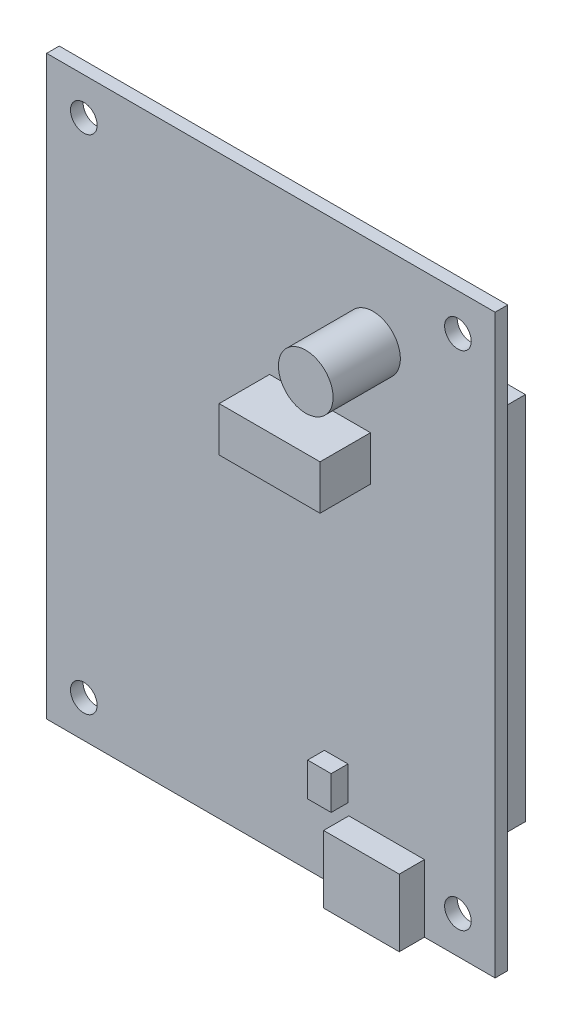
ISO-10303-21;
HEADER;
FILE_DESCRIPTION(('STEP AP214'),'2;1');
FILE_NAME('part.step','',(''),(''),'','','');
FILE_SCHEMA(('AUTOMOTIVE_DESIGN { 1 0 10303 214 1 1 1 1 }'));
ENDSEC;
DATA;
#1=APPLICATION_CONTEXT('core data for automotive mechanical design processes');
#2=APPLICATION_PROTOCOL_DEFINITION('international standard','automotive_design',2000,#1);
#3=PRODUCT_CONTEXT('',#1,'mechanical');
#4=PRODUCT('Part','Part','',(#3));
#5=PRODUCT_RELATED_PRODUCT_CATEGORY('part','',(#4));
#6=PRODUCT_DEFINITION_FORMATION('','',#4);
#7=PRODUCT_DEFINITION_CONTEXT('part definition',#1,'design');
#8=PRODUCT_DEFINITION('design','',#6,#7);
#9=PRODUCT_DEFINITION_SHAPE('','',#8);
#10=(LENGTH_UNIT() NAMED_UNIT(*) SI_UNIT(.MILLI.,.METRE.));
#11=(NAMED_UNIT(*) PLANE_ANGLE_UNIT() SI_UNIT($,.RADIAN.));
#12=(NAMED_UNIT(*) SI_UNIT($,.STERADIAN.) SOLID_ANGLE_UNIT());
#13=UNCERTAINTY_MEASURE_WITH_UNIT(LENGTH_MEASURE(1.E-05),#10,'distance_accuracy_value','');
#14=(GEOMETRIC_REPRESENTATION_CONTEXT(3) GLOBAL_UNCERTAINTY_ASSIGNED_CONTEXT((#13)) GLOBAL_UNIT_ASSIGNED_CONTEXT((#10,
#11,#12)) REPRESENTATION_CONTEXT('',''));
#15=CARTESIAN_POINT('',(0.,0.,0.));
#16=DIRECTION('',(0.,0.,1.));
#17=DIRECTION('',(1.,0.,0.));
#18=AXIS2_PLACEMENT_3D('',#15,#16,#17);
#19=CARTESIAN_POINT('',(0.,0.,1.5));
#20=DIRECTION('',(0.,0.,-1.));
#21=DIRECTION('',(-1.,0.,0.));
#22=AXIS2_PLACEMENT_3D('',#19,#20,#21);
#23=PLANE('',#22);
#24=DIRECTION('',(0.,-1.,0.));
#25=VECTOR('',#24,1.);
#26=CARTESIAN_POINT('',(33.04,13.3,1.5));
#27=LINE('',#26,#25);
#28=CARTESIAN_POINT('',(33.04,13.3,1.5));
#29=VERTEX_POINT('',#28);
#30=CARTESIAN_POINT('',(33.04,9.3,1.5));
#31=VERTEX_POINT('',#30);
#32=EDGE_CURVE('E312',#29,#31,#27,.T.);
#33=ORIENTED_EDGE('',*,*,#32,.F.);
#34=DIRECTION('',(-1.,0.,0.));
#35=VECTOR('',#34,1.);
#36=CARTESIAN_POINT('',(33.04,13.3,1.5));
#37=LINE('',#36,#35);
#38=CARTESIAN_POINT('',(35.84,13.3,1.5));
#39=VERTEX_POINT('',#38);
#40=EDGE_CURVE('E318',#39,#29,#37,.T.);
#41=ORIENTED_EDGE('',*,*,#40,.F.);
#42=DIRECTION('',(0.,1.,0.));
#43=VECTOR('',#42,1.);
#44=CARTESIAN_POINT('',(35.84,13.3,1.5));
#45=LINE('',#44,#43);
#46=CARTESIAN_POINT('',(35.84,9.3,1.5));
#47=VERTEX_POINT('',#46);
#48=EDGE_CURVE('E335',#47,#39,#45,.T.);
#49=ORIENTED_EDGE('',*,*,#48,.F.);
#50=DIRECTION('',(1.,0.,0.));
#51=VECTOR('',#50,1.);
#52=CARTESIAN_POINT('',(33.04,9.3,1.5));
#53=LINE('',#52,#51);
#54=EDGE_CURVE('E331',#31,#47,#53,.T.);
#55=ORIENTED_EDGE('',*,*,#54,.F.);
#56=EDGE_LOOP('',(#33,#41,#49,#55));
#57=FACE_BOUND('',#56,.T.);
#58=CARTESIAN_POINT('',(48.92,4.42,1.5));
#59=DIRECTION('',(0.,0.,1.));
#60=DIRECTION('',(1.,0.,0.));
#61=AXIS2_PLACEMENT_3D('',#58,#59,#60);
#62=CIRCLE('',#61,1.585);
#63=CARTESIAN_POINT('',(50.505,4.42,1.5));
#64=VERTEX_POINT('',#63);
#65=EDGE_CURVE('E407',#64,#64,#62,.T.);
#66=ORIENTED_EDGE('',*,*,#65,.F.);
#67=EDGE_LOOP('',(#66));
#68=FACE_BOUND('',#67,.T.);
#69=CARTESIAN_POINT('',(4.42000000000001,4.42,1.5));
#70=DIRECTION('',(0.,0.,1.));
#71=DIRECTION('',(1.,0.,0.));
#72=AXIS2_PLACEMENT_3D('',#69,#70,#71);
#73=CIRCLE('',#72,1.585);
#74=CARTESIAN_POINT('',(6.00500000000001,4.42,1.5));
#75=VERTEX_POINT('',#74);
#76=EDGE_CURVE('E415',#75,#75,#73,.T.);
#77=ORIENTED_EDGE('',*,*,#76,.F.);
#78=EDGE_LOOP('',(#77));
#79=FACE_BOUND('',#78,.T.);
#80=CARTESIAN_POINT('',(4.42,64.16,1.5));
#81=DIRECTION('',(0.,0.,1.));
#82=DIRECTION('',(1.,0.,0.));
#83=AXIS2_PLACEMENT_3D('',#80,#81,#82);
#84=CIRCLE('',#83,1.58499999999999);
#85=CARTESIAN_POINT('',(6.00499999999999,64.16,1.5));
#86=VERTEX_POINT('',#85);
#87=EDGE_CURVE('E423',#86,#86,#84,.T.);
#88=ORIENTED_EDGE('',*,*,#87,.F.);
#89=EDGE_LOOP('',(#88));
#90=FACE_BOUND('',#89,.T.);
#91=CARTESIAN_POINT('',(48.92,64.16,1.5));
#92=DIRECTION('',(0.,0.,1.));
#93=DIRECTION('',(1.,0.,0.));
#94=AXIS2_PLACEMENT_3D('',#91,#92,#93);
#95=CIRCLE('',#94,1.585);
#96=CARTESIAN_POINT('',(50.505,64.16,1.5));
#97=VERTEX_POINT('',#96);
#98=EDGE_CURVE('E431',#97,#97,#95,.T.);
#99=ORIENTED_EDGE('',*,*,#98,.F.);
#100=EDGE_LOOP('',(#99));
#101=FACE_BOUND('',#100,.T.);
#102=CARTESIAN_POINT('',(38.82,58.16,1.5));
#103=DIRECTION('',(0.,0.,-1.));
#104=DIRECTION('',(-1.,0.,0.));
#105=AXIS2_PLACEMENT_3D('',#102,#103,#104);
#106=CIRCLE('',#105,3.25);
#107=CARTESIAN_POINT('',(35.57,58.16,1.5));
#108=VERTEX_POINT('',#107);
#109=EDGE_CURVE('E11',#108,#108,#106,.F.);
#110=ORIENTED_EDGE('',*,*,#109,.F.);
#111=EDGE_LOOP('',(#110));
#112=FACE_BOUND('',#111,.T.);
#113=DIRECTION('',(0.,1.,0.));
#114=VECTOR('',#113,1.);
#115=CARTESIAN_POINT('',(38.52,48.76,1.5));
#116=LINE('',#115,#114);
#117=CARTESIAN_POINT('',(38.52,43.46,1.5));
#118=VERTEX_POINT('',#117);
#119=CARTESIAN_POINT('',(38.52,48.76,1.5));
#120=VERTEX_POINT('',#119);
#121=EDGE_CURVE('E357',#118,#120,#116,.T.);
#122=ORIENTED_EDGE('',*,*,#121,.F.);
#123=DIRECTION('',(1.,0.,0.));
#124=VECTOR('',#123,1.);
#125=CARTESIAN_POINT('',(38.52,43.46,1.5));
#126=LINE('',#125,#124);
#127=CARTESIAN_POINT('',(26.52,43.46,1.5));
#128=VERTEX_POINT('',#127);
#129=EDGE_CURVE('E363',#128,#118,#126,.T.);
#130=ORIENTED_EDGE('',*,*,#129,.F.);
#131=DIRECTION('',(0.,-1.,0.));
#132=VECTOR('',#131,1.);
#133=CARTESIAN_POINT('',(26.52,48.76,1.5));
#134=LINE('',#133,#132);
#135=CARTESIAN_POINT('',(26.52,48.76,1.5));
#136=VERTEX_POINT('',#135);
#137=EDGE_CURVE('E380',#136,#128,#134,.T.);
#138=ORIENTED_EDGE('',*,*,#137,.F.);
#139=DIRECTION('',(-1.,0.,0.));
#140=VECTOR('',#139,1.);
#141=CARTESIAN_POINT('',(38.52,48.76,1.5));
#142=LINE('',#141,#140);
#143=EDGE_CURVE('E376',#120,#136,#142,.T.);
#144=ORIENTED_EDGE('',*,*,#143,.F.);
#145=EDGE_LOOP('',(#122,#130,#138,#144));
#146=FACE_BOUND('',#145,.T.);
#147=DIRECTION('',(0.,-1.,0.));
#148=VECTOR('',#147,1.);
#149=CARTESIAN_POINT('',(35.94,0.,1.5));
#150=LINE('',#149,#148);
#151=CARTESIAN_POINT('',(35.94,8.,1.5));
#152=VERTEX_POINT('',#151);
#153=CARTESIAN_POINT('',(35.94,0.,1.5));
#154=VERTEX_POINT('',#153);
#155=EDGE_CURVE('E55',#152,#154,#150,.T.);
#156=ORIENTED_EDGE('',*,*,#155,.F.);
#157=DIRECTION('',(-1.,0.,0.));
#158=VECTOR('',#157,1.);
#159=CARTESIAN_POINT('',(35.94,8.,1.5));
#160=LINE('',#159,#158);
#161=CARTESIAN_POINT('',(44.94,8.,1.5));
#162=VERTEX_POINT('',#161);
#163=EDGE_CURVE('E59',#162,#152,#160,.T.);
#164=ORIENTED_EDGE('',*,*,#163,.F.);
#165=DIRECTION('',(0.,1.,0.));
#166=VECTOR('',#165,1.);
#167=CARTESIAN_POINT('',(44.94,0.,1.5));
#168=LINE('',#167,#166);
#169=CARTESIAN_POINT('',(44.94,0.,1.5));
#170=VERTEX_POINT('',#169);
#171=EDGE_CURVE('E496',#170,#162,#168,.T.);
#172=ORIENTED_EDGE('',*,*,#171,.F.);
#173=DIRECTION('',(1.,0.,0.));
#174=VECTOR('',#173,1.);
#175=CARTESIAN_POINT('',(0.,0.,1.5));
#176=LINE('',#175,#174);
#177=CARTESIAN_POINT('',(53.34,0.,1.5));
#178=VERTEX_POINT('',#177);
#179=EDGE_CURVE('E443',#170,#178,#176,.T.);
#180=ORIENTED_EDGE('',*,*,#179,.T.);
#181=DIRECTION('',(0.,1.,0.));
#182=VECTOR('',#181,1.);
#183=CARTESIAN_POINT('',(53.34,0.,1.5));
#184=LINE('',#183,#182);
#185=CARTESIAN_POINT('',(53.34,68.58,1.5));
#186=VERTEX_POINT('',#185);
#187=EDGE_CURVE('E448',#178,#186,#184,.T.);
#188=ORIENTED_EDGE('',*,*,#187,.T.);
#189=DIRECTION('',(-1.,0.,0.));
#190=VECTOR('',#189,1.);
#191=CARTESIAN_POINT('',(0.,68.58,1.5));
#192=LINE('',#191,#190);
#193=CARTESIAN_POINT('',(0.,68.58,1.5));
#194=VERTEX_POINT('',#193);
#195=EDGE_CURVE('E451',#186,#194,#192,.T.);
#196=ORIENTED_EDGE('',*,*,#195,.T.);
#197=DIRECTION('',(0.,-1.,0.));
#198=VECTOR('',#197,1.);
#199=CARTESIAN_POINT('',(0.,0.,1.5));
#200=LINE('',#199,#198);
#201=CARTESIAN_POINT('',(0.,0.,1.5));
#202=VERTEX_POINT('',#201);
#203=EDGE_CURVE('E439',#194,#202,#200,.T.);
#204=ORIENTED_EDGE('',*,*,#203,.T.);
#205=EDGE_CURVE('E445',#202,#154,#176,.T.);
#206=ORIENTED_EDGE('',*,*,#205,.T.);
#207=EDGE_LOOP('',(#156,#164,#172,#180,#188,#196,#204,#206));
#208=FACE_BOUND('',#207,.T.);
#209=ADVANCED_FACE('F39',(#57,#68,#79,#90,#101,#112,#146,#208),#23,.F.);
#210=CARTESIAN_POINT('',(0.,0.,0.));
#211=DIRECTION('',(0.,0.,-1.));
#212=DIRECTION('',(-1.,0.,0.));
#213=AXIS2_PLACEMENT_3D('',#210,#211,#212);
#214=PLANE('',#213);
#215=CARTESIAN_POINT('',(4.42000000000001,4.42,0.));
#216=DIRECTION('',(0.,0.,1.));
#217=DIRECTION('',(1.,0.,0.));
#218=AXIS2_PLACEMENT_3D('',#215,#216,#217);
#219=CIRCLE('',#218,1.585);
#220=CARTESIAN_POINT('',(6.00500000000001,4.42,0.));
#221=VERTEX_POINT('',#220);
#222=EDGE_CURVE('E411',#221,#221,#219,.T.);
#223=ORIENTED_EDGE('',*,*,#222,.T.);
#224=EDGE_LOOP('',(#223));
#225=FACE_BOUND('',#224,.T.);
#226=CARTESIAN_POINT('',(48.92,64.16,0.));
#227=DIRECTION('',(0.,0.,1.));
#228=DIRECTION('',(1.,0.,0.));
#229=AXIS2_PLACEMENT_3D('',#226,#227,#228);
#230=CIRCLE('',#229,1.585);
#231=CARTESIAN_POINT('',(50.505,64.16,0.));
#232=VERTEX_POINT('',#231);
#233=EDGE_CURVE('E427',#232,#232,#230,.T.);
#234=ORIENTED_EDGE('',*,*,#233,.T.);
#235=EDGE_LOOP('',(#234));
#236=FACE_BOUND('',#235,.T.);
#237=DIRECTION('',(0.,-1.,0.));
#238=VECTOR('',#237,1.);
#239=CARTESIAN_POINT('',(0.,0.,0.));
#240=LINE('',#239,#238);
#241=CARTESIAN_POINT('',(0.,68.58,0.));
#242=VERTEX_POINT('',#241);
#243=CARTESIAN_POINT('',(0.,0.,0.));
#244=VERTEX_POINT('',#243);
#245=EDGE_CURVE('E435',#242,#244,#240,.T.);
#246=ORIENTED_EDGE('',*,*,#245,.F.);
#247=DIRECTION('',(-1.,0.,0.));
#248=VECTOR('',#247,1.);
#249=CARTESIAN_POINT('',(0.,68.58,0.));
#250=LINE('',#249,#248);
#251=CARTESIAN_POINT('',(53.34,68.58,0.));
#252=VERTEX_POINT('',#251);
#253=EDGE_CURVE('E444',#252,#242,#250,.T.);
#254=ORIENTED_EDGE('',*,*,#253,.F.);
#255=DIRECTION('',(0.,1.,0.));
#256=VECTOR('',#255,1.);
#257=CARTESIAN_POINT('',(53.34,0.,0.));
#258=LINE('',#257,#256);
#259=CARTESIAN_POINT('',(53.34,0.,0.));
#260=VERTEX_POINT('',#259);
#261=EDGE_CURVE('E461',#260,#252,#258,.T.);
#262=ORIENTED_EDGE('',*,*,#261,.F.);
#263=DIRECTION('',(1.,0.,0.));
#264=VECTOR('',#263,1.);
#265=CARTESIAN_POINT('',(0.,0.,0.));
#266=LINE('',#265,#264);
#267=EDGE_CURVE('E458',#244,#260,#266,.T.);
#268=ORIENTED_EDGE('',*,*,#267,.F.);
#269=EDGE_LOOP('',(#246,#254,#262,#268));
#270=FACE_BOUND('',#269,.T.);
#271=CARTESIAN_POINT('',(4.42,64.16,0.));
#272=DIRECTION('',(0.,0.,1.));
#273=DIRECTION('',(1.,0.,0.));
#274=AXIS2_PLACEMENT_3D('',#271,#272,#273);
#275=CIRCLE('',#274,1.58499999999999);
#276=CARTESIAN_POINT('',(6.00499999999999,64.16,0.));
#277=VERTEX_POINT('',#276);
#278=EDGE_CURVE('E419',#277,#277,#275,.T.);
#279=ORIENTED_EDGE('',*,*,#278,.T.);
#280=EDGE_LOOP('',(#279));
#281=FACE_BOUND('',#280,.T.);
#282=CARTESIAN_POINT('',(48.92,4.42,0.));
#283=DIRECTION('',(0.,0.,1.));
#284=DIRECTION('',(1.,0.,0.));
#285=AXIS2_PLACEMENT_3D('',#282,#283,#284);
#286=CIRCLE('',#285,1.585);
#287=CARTESIAN_POINT('',(50.505,4.42,0.));
#288=VERTEX_POINT('',#287);
#289=EDGE_CURVE('E406',#288,#288,#286,.T.);
#290=ORIENTED_EDGE('',*,*,#289,.T.);
#291=EDGE_LOOP('',(#290));
#292=FACE_BOUND('',#291,.T.);
#293=DIRECTION('',(1.,0.,0.));
#294=VECTOR('',#293,1.);
#295=CARTESIAN_POINT('',(46.64,56.4,0.));
#296=LINE('',#295,#294);
#297=CARTESIAN_POINT('',(46.64,56.4,0.));
#298=VERTEX_POINT('',#297);
#299=CARTESIAN_POINT('',(51.44,56.4,0.));
#300=VERTEX_POINT('',#299);
#301=EDGE_CURVE('E290',#298,#300,#296,.T.);
#302=ORIENTED_EDGE('',*,*,#301,.F.);
#303=DIRECTION('',(0.,1.,0.));
#304=VECTOR('',#303,1.);
#305=CARTESIAN_POINT('',(46.64,56.4,0.));
#306=LINE('',#305,#304);
#307=CARTESIAN_POINT('',(46.64,12.4,0.));
#308=VERTEX_POINT('',#307);
#309=EDGE_CURVE('E271',#308,#298,#306,.T.);
#310=ORIENTED_EDGE('',*,*,#309,.F.);
#311=DIRECTION('',(-1.,0.,0.));
#312=VECTOR('',#311,1.);
#313=CARTESIAN_POINT('',(46.64,12.4,0.));
#314=LINE('',#313,#312);
#315=CARTESIAN_POINT('',(51.44,12.4,0.));
#316=VERTEX_POINT('',#315);
#317=EDGE_CURVE('E277',#316,#308,#314,.T.);
#318=ORIENTED_EDGE('',*,*,#317,.F.);
#319=DIRECTION('',(0.,-1.,0.));
#320=VECTOR('',#319,1.);
#321=CARTESIAN_POINT('',(51.44,56.4,0.));
#322=LINE('',#321,#320);
#323=EDGE_CURVE('E293',#300,#316,#322,.T.);
#324=ORIENTED_EDGE('',*,*,#323,.F.);
#325=EDGE_LOOP('',(#302,#310,#318,#324));
#326=FACE_BOUND('',#325,.T.);
#327=DIRECTION('',(1.,0.,0.));
#328=VECTOR('',#327,1.);
#329=CARTESIAN_POINT('',(1.9,56.4,0.));
#330=LINE('',#329,#328);
#331=CARTESIAN_POINT('',(1.9,56.4,0.));
#332=VERTEX_POINT('',#331);
#333=CARTESIAN_POINT('',(6.7,56.4,0.));
#334=VERTEX_POINT('',#333);
#335=EDGE_CURVE('E229',#332,#334,#330,.T.);
#336=ORIENTED_EDGE('',*,*,#335,.F.);
#337=DIRECTION('',(0.,1.,0.));
#338=VECTOR('',#337,1.);
#339=CARTESIAN_POINT('',(1.9,56.4,0.));
#340=LINE('',#339,#338);
#341=CARTESIAN_POINT('',(1.90000000000002,12.4,0.));
#342=VERTEX_POINT('',#341);
#343=EDGE_CURVE('E224',#342,#332,#340,.T.);
#344=ORIENTED_EDGE('',*,*,#343,.F.);
#345=DIRECTION('',(-1.,0.,0.));
#346=VECTOR('',#345,1.);
#347=CARTESIAN_POINT('',(1.90000000000002,12.4,0.));
#348=LINE('',#347,#346);
#349=CARTESIAN_POINT('',(6.70000000000001,12.4,0.));
#350=VERTEX_POINT('',#349);
#351=EDGE_CURVE('E240',#350,#342,#348,.T.);
#352=ORIENTED_EDGE('',*,*,#351,.F.);
#353=DIRECTION('',(0.,-1.,0.));
#354=VECTOR('',#353,1.);
#355=CARTESIAN_POINT('',(6.7,56.4,0.));
#356=LINE('',#355,#354);
#357=EDGE_CURVE('E252',#334,#350,#356,.T.);
#358=ORIENTED_EDGE('',*,*,#357,.F.);
#359=EDGE_LOOP('',(#336,#344,#352,#358));
#360=FACE_BOUND('',#359,.T.);
#361=ADVANCED_FACE('F486',(#225,#236,#270,#281,#292,#326,#360),#214,.T.);
#362=CARTESIAN_POINT('',(0.,0.,1.5));
#363=DIRECTION('',(1.,0.,0.));
#364=DIRECTION('',(0.,0.,-1.));
#365=AXIS2_PLACEMENT_3D('',#362,#363,#364);
#366=PLANE('',#365);
#367=ORIENTED_EDGE('',*,*,#245,.T.);
#368=DIRECTION('',(0.,0.,-1.));
#369=VECTOR('',#368,1.);
#370=CARTESIAN_POINT('',(0.,0.,1.5));
#371=LINE('',#370,#369);
#372=EDGE_CURVE('E48',#202,#244,#371,.T.);
#373=ORIENTED_EDGE('',*,*,#372,.F.);
#374=ORIENTED_EDGE('',*,*,#203,.F.);
#375=DIRECTION('',(0.,0.,-1.));
#376=VECTOR('',#375,1.);
#377=CARTESIAN_POINT('',(0.,68.58,1.5));
#378=LINE('',#377,#376);
#379=EDGE_CURVE('E454',#194,#242,#378,.T.);
#380=ORIENTED_EDGE('',*,*,#379,.T.);
#381=EDGE_LOOP('',(#367,#373,#374,#380));
#382=FACE_BOUND('',#381,.T.);
#383=ADVANCED_FACE('F41',(#382),#366,.F.);
#384=CARTESIAN_POINT('',(0.,0.,1.5));
#385=DIRECTION('',(0.,1.,0.));
#386=DIRECTION('',(0.,0.,1.));
#387=AXIS2_PLACEMENT_3D('',#384,#385,#386);
#388=PLANE('',#387);
#389=ORIENTED_EDGE('',*,*,#267,.T.);
#390=DIRECTION('',(0.,0.,-1.));
#391=VECTOR('',#390,1.);
#392=CARTESIAN_POINT('',(53.34,0.,1.5));
#393=LINE('',#392,#391);
#394=EDGE_CURVE('E473',#178,#260,#393,.T.);
#395=ORIENTED_EDGE('',*,*,#394,.F.);
#396=ORIENTED_EDGE('',*,*,#179,.F.);
#397=DIRECTION('',(0.,0.,-1.));
#398=VECTOR('',#397,1.);
#399=CARTESIAN_POINT('',(44.94,0.,4.5));
#400=LINE('',#399,#398);
#401=CARTESIAN_POINT('',(44.94,0.,4.5));
#402=VERTEX_POINT('',#401);
#403=EDGE_CURVE('E206',#402,#170,#400,.T.);
#404=ORIENTED_EDGE('',*,*,#403,.F.);
#405=DIRECTION('',(1.,0.,0.));
#406=VECTOR('',#405,1.);
#407=CARTESIAN_POINT('',(35.94,0.,4.5));
#408=LINE('',#407,#406);
#409=CARTESIAN_POINT('',(35.94,0.,4.5));
#410=VERTEX_POINT('',#409);
#411=EDGE_CURVE('E200',#410,#402,#408,.T.);
#412=ORIENTED_EDGE('',*,*,#411,.F.);
#413=DIRECTION('',(0.,0.,-1.));
#414=VECTOR('',#413,1.);
#415=CARTESIAN_POINT('',(35.94,0.,4.5));
#416=LINE('',#415,#414);
#417=EDGE_CURVE('E204',#410,#154,#416,.T.);
#418=ORIENTED_EDGE('',*,*,#417,.T.);
#419=ORIENTED_EDGE('',*,*,#205,.F.);
#420=ORIENTED_EDGE('',*,*,#372,.T.);
#421=EDGE_LOOP('',(#389,#395,#396,#404,#412,#418,#419,#420));
#422=FACE_BOUND('',#421,.T.);
#423=ADVANCED_FACE('F202',(#422),#388,.F.);
#424=CARTESIAN_POINT('',(53.34,0.,1.5));
#425=DIRECTION('',(-1.,0.,0.));
#426=DIRECTION('',(0.,0.,1.));
#427=AXIS2_PLACEMENT_3D('',#424,#425,#426);
#428=PLANE('',#427);
#429=ORIENTED_EDGE('',*,*,#261,.T.);
#430=DIRECTION('',(0.,0.,-1.));
#431=VECTOR('',#430,1.);
#432=CARTESIAN_POINT('',(53.34,68.58,1.5));
#433=LINE('',#432,#431);
#434=EDGE_CURVE('E469',#186,#252,#433,.T.);
#435=ORIENTED_EDGE('',*,*,#434,.F.);
#436=ORIENTED_EDGE('',*,*,#187,.F.);
#437=ORIENTED_EDGE('',*,*,#394,.T.);
#438=EDGE_LOOP('',(#429,#435,#436,#437));
#439=FACE_BOUND('',#438,.T.);
#440=ADVANCED_FACE('F491',(#439),#428,.F.);
#441=CARTESIAN_POINT('',(0.,68.58,1.5));
#442=DIRECTION('',(0.,-1.,0.));
#443=DIRECTION('',(0.,0.,-1.));
#444=AXIS2_PLACEMENT_3D('',#441,#442,#443);
#445=PLANE('',#444);
#446=ORIENTED_EDGE('',*,*,#253,.T.);
#447=ORIENTED_EDGE('',*,*,#379,.F.);
#448=ORIENTED_EDGE('',*,*,#195,.F.);
#449=ORIENTED_EDGE('',*,*,#434,.T.);
#450=EDGE_LOOP('',(#446,#447,#448,#449));
#451=FACE_BOUND('',#450,.T.);
#452=ADVANCED_FACE('F495',(#451),#445,.F.);
#453=CARTESIAN_POINT('',(48.92,64.16,1.5));
#454=DIRECTION('',(0.,0.,-1.));
#455=DIRECTION('',(-1.,0.,0.));
#456=AXIS2_PLACEMENT_3D('',#453,#454,#455);
#457=CYLINDRICAL_SURFACE('',#456,1.585);
#458=ORIENTED_EDGE('',*,*,#98,.T.);
#459=EDGE_LOOP('',(#458));
#460=FACE_BOUND('',#459,.T.);
#461=ORIENTED_EDGE('',*,*,#233,.F.);
#462=EDGE_LOOP('',(#461));
#463=FACE_BOUND('',#462,.T.);
#464=ADVANCED_FACE('F536',(#460,#463),#457,.F.);
#465=CARTESIAN_POINT('',(4.42,64.16,1.5));
#466=DIRECTION('',(0.,0.,-1.));
#467=DIRECTION('',(-1.,0.,0.));
#468=AXIS2_PLACEMENT_3D('',#465,#466,#467);
#469=CYLINDRICAL_SURFACE('',#468,1.58499999999999);
#470=ORIENTED_EDGE('',*,*,#87,.T.);
#471=EDGE_LOOP('',(#470));
#472=FACE_BOUND('',#471,.T.);
#473=ORIENTED_EDGE('',*,*,#278,.F.);
#474=EDGE_LOOP('',(#473));
#475=FACE_BOUND('',#474,.T.);
#476=ADVANCED_FACE('F749',(#472,#475),#469,.F.);
#477=CARTESIAN_POINT('',(4.42000000000001,4.42,1.5));
#478=DIRECTION('',(0.,0.,-1.));
#479=DIRECTION('',(-1.,0.,0.));
#480=AXIS2_PLACEMENT_3D('',#477,#478,#479);
#481=CYLINDRICAL_SURFACE('',#480,1.585);
#482=ORIENTED_EDGE('',*,*,#76,.T.);
#483=EDGE_LOOP('',(#482));
#484=FACE_BOUND('',#483,.T.);
#485=ORIENTED_EDGE('',*,*,#222,.F.);
#486=EDGE_LOOP('',(#485));
#487=FACE_BOUND('',#486,.T.);
#488=ADVANCED_FACE('F746',(#484,#487),#481,.F.);
#489=CARTESIAN_POINT('',(48.92,4.42,1.5));
#490=DIRECTION('',(0.,0.,-1.));
#491=DIRECTION('',(-1.,0.,0.));
#492=AXIS2_PLACEMENT_3D('',#489,#490,#491);
#493=CYLINDRICAL_SURFACE('',#492,1.585);
#494=ORIENTED_EDGE('',*,*,#65,.T.);
#495=EDGE_LOOP('',(#494));
#496=FACE_BOUND('',#495,.T.);
#497=ORIENTED_EDGE('',*,*,#289,.F.);
#498=EDGE_LOOP('',(#497));
#499=FACE_BOUND('',#498,.T.);
#500=ADVANCED_FACE('F742',(#496,#499),#493,.F.);
#501=CARTESIAN_POINT('',(38.82,58.16,9.5));
#502=DIRECTION('',(0.,0.,-1.));
#503=DIRECTION('',(-1.,0.,0.));
#504=AXIS2_PLACEMENT_3D('',#501,#502,#503);
#505=CYLINDRICAL_SURFACE('',#504,3.25);
#506=CARTESIAN_POINT('',(38.82,58.16,9.5));
#507=DIRECTION('',(0.,0.,1.));
#508=DIRECTION('',(1.,0.,0.));
#509=AXIS2_PLACEMENT_3D('',#506,#507,#508);
#510=CIRCLE('',#509,3.25);
#511=CARTESIAN_POINT('',(42.07,58.16,9.5));
#512=VERTEX_POINT('',#511);
#513=EDGE_CURVE('E402',#512,#512,#510,.T.);
#514=ORIENTED_EDGE('',*,*,#513,.F.);
#515=EDGE_LOOP('',(#514));
#516=FACE_BOUND('',#515,.T.);
#517=ORIENTED_EDGE('',*,*,#109,.T.);
#518=EDGE_LOOP('',(#517));
#519=FACE_BOUND('',#518,.T.);
#520=ADVANCED_FACE('F738',(#516,#519),#505,.T.);
#521=CARTESIAN_POINT('',(38.82,58.16,9.5));
#522=DIRECTION('',(0.,0.,1.));
#523=DIRECTION('',(1.,0.,0.));
#524=AXIS2_PLACEMENT_3D('',#521,#522,#523);
#525=PLANE('',#524);
#526=ORIENTED_EDGE('',*,*,#513,.T.);
#527=EDGE_LOOP('',(#526));
#528=FACE_BOUND('',#527,.T.);
#529=ADVANCED_FACE('F734',(#528),#525,.T.);
#530=CARTESIAN_POINT('',(38.52,48.76,7.5));
#531=DIRECTION('',(-1.,0.,0.));
#532=DIRECTION('',(0.,0.,1.));
#533=AXIS2_PLACEMENT_3D('',#530,#531,#532);
#534=PLANE('',#533);
#535=ORIENTED_EDGE('',*,*,#121,.T.);
#536=DIRECTION('',(0.,0.,-1.));
#537=VECTOR('',#536,1.);
#538=CARTESIAN_POINT('',(38.52,48.76,7.5));
#539=LINE('',#538,#537);
#540=CARTESIAN_POINT('',(38.52,48.76,7.5));
#541=VERTEX_POINT('',#540);
#542=EDGE_CURVE('E398',#541,#120,#539,.T.);
#543=ORIENTED_EDGE('',*,*,#542,.F.);
#544=DIRECTION('',(0.,1.,0.));
#545=VECTOR('',#544,1.);
#546=CARTESIAN_POINT('',(38.52,48.76,7.5));
#547=LINE('',#546,#545);
#548=CARTESIAN_POINT('',(38.52,43.46,7.5));
#549=VERTEX_POINT('',#548);
#550=EDGE_CURVE('E358',#549,#541,#547,.T.);
#551=ORIENTED_EDGE('',*,*,#550,.F.);
#552=DIRECTION('',(0.,0.,-1.));
#553=VECTOR('',#552,1.);
#554=CARTESIAN_POINT('',(38.52,43.46,7.5));
#555=LINE('',#554,#553);
#556=EDGE_CURVE('E372',#549,#118,#555,.T.);
#557=ORIENTED_EDGE('',*,*,#556,.T.);
#558=EDGE_LOOP('',(#535,#543,#551,#557));
#559=FACE_BOUND('',#558,.T.);
#560=ADVANCED_FACE('F730',(#559),#534,.F.);
#561=CARTESIAN_POINT('',(38.52,48.76,7.5));
#562=DIRECTION('',(0.,-1.,0.));
#563=DIRECTION('',(0.,0.,-1.));
#564=AXIS2_PLACEMENT_3D('',#561,#562,#563);
#565=PLANE('',#564);
#566=ORIENTED_EDGE('',*,*,#143,.T.);
#567=DIRECTION('',(0.,0.,-1.));
#568=VECTOR('',#567,1.);
#569=CARTESIAN_POINT('',(26.52,48.76,7.5));
#570=LINE('',#569,#568);
#571=CARTESIAN_POINT('',(26.52,48.76,7.5));
#572=VERTEX_POINT('',#571);
#573=EDGE_CURVE('E394',#572,#136,#570,.T.);
#574=ORIENTED_EDGE('',*,*,#573,.F.);
#575=DIRECTION('',(-1.,0.,0.));
#576=VECTOR('',#575,1.);
#577=CARTESIAN_POINT('',(38.52,48.76,7.5));
#578=LINE('',#577,#576);
#579=EDGE_CURVE('E362',#541,#572,#578,.T.);
#580=ORIENTED_EDGE('',*,*,#579,.F.);
#581=ORIENTED_EDGE('',*,*,#542,.T.);
#582=EDGE_LOOP('',(#566,#574,#580,#581));
#583=FACE_BOUND('',#582,.T.);
#584=ADVANCED_FACE('F726',(#583),#565,.F.);
#585=CARTESIAN_POINT('',(26.52,48.76,7.5));
#586=DIRECTION('',(1.,0.,0.));
#587=DIRECTION('',(0.,0.,-1.));
#588=AXIS2_PLACEMENT_3D('',#585,#586,#587);
#589=PLANE('',#588);
#590=ORIENTED_EDGE('',*,*,#137,.T.);
#591=DIRECTION('',(0.,0.,-1.));
#592=VECTOR('',#591,1.);
#593=CARTESIAN_POINT('',(26.52,43.46,7.5));
#594=LINE('',#593,#592);
#595=CARTESIAN_POINT('',(26.52,43.46,7.5));
#596=VERTEX_POINT('',#595);
#597=EDGE_CURVE('E390',#596,#128,#594,.T.);
#598=ORIENTED_EDGE('',*,*,#597,.F.);
#599=DIRECTION('',(0.,-1.,0.));
#600=VECTOR('',#599,1.);
#601=CARTESIAN_POINT('',(26.52,48.76,7.5));
#602=LINE('',#601,#600);
#603=EDGE_CURVE('E366',#572,#596,#602,.T.);
#604=ORIENTED_EDGE('',*,*,#603,.F.);
#605=ORIENTED_EDGE('',*,*,#573,.T.);
#606=EDGE_LOOP('',(#590,#598,#604,#605));
#607=FACE_BOUND('',#606,.T.);
#608=ADVANCED_FACE('F722',(#607),#589,.F.);
#609=CARTESIAN_POINT('',(38.52,43.46,7.5));
#610=DIRECTION('',(0.,1.,0.));
#611=DIRECTION('',(0.,0.,1.));
#612=AXIS2_PLACEMENT_3D('',#609,#610,#611);
#613=PLANE('',#612);
#614=ORIENTED_EDGE('',*,*,#129,.T.);
#615=ORIENTED_EDGE('',*,*,#556,.F.);
#616=DIRECTION('',(1.,0.,0.));
#617=VECTOR('',#616,1.);
#618=CARTESIAN_POINT('',(38.52,43.46,7.5));
#619=LINE('',#618,#617);
#620=EDGE_CURVE('E369',#596,#549,#619,.T.);
#621=ORIENTED_EDGE('',*,*,#620,.F.);
#622=ORIENTED_EDGE('',*,*,#597,.T.);
#623=EDGE_LOOP('',(#614,#615,#621,#622));
#624=FACE_BOUND('',#623,.T.);
#625=ADVANCED_FACE('F718',(#624),#613,.F.);
#626=CARTESIAN_POINT('',(0.,0.,7.5));
#627=DIRECTION('',(0.,0.,-1.));
#628=DIRECTION('',(-1.,0.,0.));
#629=AXIS2_PLACEMENT_3D('',#626,#627,#628);
#630=PLANE('',#629);
#631=ORIENTED_EDGE('',*,*,#550,.T.);
#632=ORIENTED_EDGE('',*,*,#579,.T.);
#633=ORIENTED_EDGE('',*,*,#603,.T.);
#634=ORIENTED_EDGE('',*,*,#620,.T.);
#635=EDGE_LOOP('',(#631,#632,#633,#634));
#636=FACE_BOUND('',#635,.T.);
#637=ADVANCED_FACE('F714',(#636),#630,.F.);
#638=CARTESIAN_POINT('',(33.04,13.3,3.5));
#639=DIRECTION('',(1.,0.,0.));
#640=DIRECTION('',(0.,0.,-1.));
#641=AXIS2_PLACEMENT_3D('',#638,#639,#640);
#642=PLANE('',#641);
#643=ORIENTED_EDGE('',*,*,#32,.T.);
#644=DIRECTION('',(0.,0.,-1.));
#645=VECTOR('',#644,1.);
#646=CARTESIAN_POINT('',(33.04,9.3,3.5));
#647=LINE('',#646,#645);
#648=CARTESIAN_POINT('',(33.04,9.3,3.5));
#649=VERTEX_POINT('',#648);
#650=EDGE_CURVE('E353',#649,#31,#647,.T.);
#651=ORIENTED_EDGE('',*,*,#650,.F.);
#652=DIRECTION('',(0.,-1.,0.));
#653=VECTOR('',#652,1.);
#654=CARTESIAN_POINT('',(33.04,13.3,3.5));
#655=LINE('',#654,#653);
#656=CARTESIAN_POINT('',(33.04,13.3,3.5));
#657=VERTEX_POINT('',#656);
#658=EDGE_CURVE('E313',#657,#649,#655,.T.);
#659=ORIENTED_EDGE('',*,*,#658,.F.);
#660=DIRECTION('',(0.,0.,-1.));
#661=VECTOR('',#660,1.);
#662=CARTESIAN_POINT('',(33.04,13.3,3.5));
#663=LINE('',#662,#661);
#664=EDGE_CURVE('E327',#657,#29,#663,.T.);
#665=ORIENTED_EDGE('',*,*,#664,.T.);
#666=EDGE_LOOP('',(#643,#651,#659,#665));
#667=FACE_BOUND('',#666,.T.);
#668=ADVANCED_FACE('F710',(#667),#642,.F.);
#669=CARTESIAN_POINT('',(33.04,9.3,3.5));
#670=DIRECTION('',(0.,1.,0.));
#671=DIRECTION('',(0.,0.,1.));
#672=AXIS2_PLACEMENT_3D('',#669,#670,#671);
#673=PLANE('',#672);
#674=ORIENTED_EDGE('',*,*,#54,.T.);
#675=DIRECTION('',(0.,0.,-1.));
#676=VECTOR('',#675,1.);
#677=CARTESIAN_POINT('',(35.84,9.3,3.5));
#678=LINE('',#677,#676);
#679=CARTESIAN_POINT('',(35.84,9.3,3.5));
#680=VERTEX_POINT('',#679);
#681=EDGE_CURVE('E349',#680,#47,#678,.T.);
#682=ORIENTED_EDGE('',*,*,#681,.F.);
#683=DIRECTION('',(1.,0.,0.));
#684=VECTOR('',#683,1.);
#685=CARTESIAN_POINT('',(33.04,9.3,3.5));
#686=LINE('',#685,#684);
#687=EDGE_CURVE('E317',#649,#680,#686,.T.);
#688=ORIENTED_EDGE('',*,*,#687,.F.);
#689=ORIENTED_EDGE('',*,*,#650,.T.);
#690=EDGE_LOOP('',(#674,#682,#688,#689));
#691=FACE_BOUND('',#690,.T.);
#692=ADVANCED_FACE('F706',(#691),#673,.F.);
#693=CARTESIAN_POINT('',(35.84,13.3,3.5));
#694=DIRECTION('',(-1.,0.,0.));
#695=DIRECTION('',(0.,0.,1.));
#696=AXIS2_PLACEMENT_3D('',#693,#694,#695);
#697=PLANE('',#696);
#698=ORIENTED_EDGE('',*,*,#48,.T.);
#699=DIRECTION('',(0.,0.,-1.));
#700=VECTOR('',#699,1.);
#701=CARTESIAN_POINT('',(35.84,13.3,3.5));
#702=LINE('',#701,#700);
#703=CARTESIAN_POINT('',(35.84,13.3,3.5));
#704=VERTEX_POINT('',#703);
#705=EDGE_CURVE('E345',#704,#39,#702,.T.);
#706=ORIENTED_EDGE('',*,*,#705,.F.);
#707=DIRECTION('',(0.,1.,0.));
#708=VECTOR('',#707,1.);
#709=CARTESIAN_POINT('',(35.84,13.3,3.5));
#710=LINE('',#709,#708);
#711=EDGE_CURVE('E321',#680,#704,#710,.T.);
#712=ORIENTED_EDGE('',*,*,#711,.F.);
#713=ORIENTED_EDGE('',*,*,#681,.T.);
#714=EDGE_LOOP('',(#698,#706,#712,#713));
#715=FACE_BOUND('',#714,.T.);
#716=ADVANCED_FACE('F702',(#715),#697,.F.);
#717=CARTESIAN_POINT('',(33.04,13.3,3.5));
#718=DIRECTION('',(0.,-1.,0.));
#719=DIRECTION('',(0.,0.,-1.));
#720=AXIS2_PLACEMENT_3D('',#717,#718,#719);
#721=PLANE('',#720);
#722=ORIENTED_EDGE('',*,*,#40,.T.);
#723=ORIENTED_EDGE('',*,*,#664,.F.);
#724=DIRECTION('',(-1.,0.,0.));
#725=VECTOR('',#724,1.);
#726=CARTESIAN_POINT('',(33.04,13.3,3.5));
#727=LINE('',#726,#725);
#728=EDGE_CURVE('E324',#704,#657,#727,.T.);
#729=ORIENTED_EDGE('',*,*,#728,.F.);
#730=ORIENTED_EDGE('',*,*,#705,.T.);
#731=EDGE_LOOP('',(#722,#723,#729,#730));
#732=FACE_BOUND('',#731,.T.);
#733=ADVANCED_FACE('F698',(#732),#721,.F.);
#734=CARTESIAN_POINT('',(0.,0.,3.5));
#735=DIRECTION('',(0.,0.,1.));
#736=DIRECTION('',(1.,0.,0.));
#737=AXIS2_PLACEMENT_3D('',#734,#735,#736);
#738=PLANE('',#737);
#739=ORIENTED_EDGE('',*,*,#658,.T.);
#740=ORIENTED_EDGE('',*,*,#687,.T.);
#741=ORIENTED_EDGE('',*,*,#711,.T.);
#742=ORIENTED_EDGE('',*,*,#728,.T.);
#743=EDGE_LOOP('',(#739,#740,#741,#742));
#744=FACE_BOUND('',#743,.T.);
#745=ADVANCED_FACE('F561',(#744),#738,.T.);
#746=CARTESIAN_POINT('',(46.64,56.4,-4.));
#747=DIRECTION('',(1.,0.,0.));
#748=DIRECTION('',(0.,1.,0.));
#749=AXIS2_PLACEMENT_3D('',#746,#747,#748);
#750=PLANE('',#749);
#751=ORIENTED_EDGE('',*,*,#309,.T.);
#752=DIRECTION('',(0.,0.,1.));
#753=VECTOR('',#752,1.);
#754=CARTESIAN_POINT('',(46.64,56.4,-4.));
#755=LINE('',#754,#753);
#756=CARTESIAN_POINT('',(46.64,56.4,-4.));
#757=VERTEX_POINT('',#756);
#758=EDGE_CURVE('E309',#757,#298,#755,.T.);
#759=ORIENTED_EDGE('',*,*,#758,.F.);
#760=DIRECTION('',(0.,1.,0.));
#761=VECTOR('',#760,1.);
#762=CARTESIAN_POINT('',(46.64,56.4,-4.));
#763=LINE('',#762,#761);
#764=CARTESIAN_POINT('',(46.64,12.4,-4.));
#765=VERTEX_POINT('',#764);
#766=EDGE_CURVE('E272',#765,#757,#763,.T.);
#767=ORIENTED_EDGE('',*,*,#766,.F.);
#768=DIRECTION('',(0.,0.,1.));
#769=VECTOR('',#768,1.);
#770=CARTESIAN_POINT('',(46.64,12.4,-4.));
#771=LINE('',#770,#769);
#772=EDGE_CURVE('E286',#765,#308,#771,.T.);
#773=ORIENTED_EDGE('',*,*,#772,.T.);
#774=EDGE_LOOP('',(#751,#759,#767,#773));
#775=FACE_BOUND('',#774,.T.);
#776=ADVANCED_FACE('F565',(#775),#750,.F.);
#777=CARTESIAN_POINT('',(46.64,56.4,-4.));
#778=DIRECTION('',(0.,-1.,0.));
#779=DIRECTION('',(1.,0.,0.));
#780=AXIS2_PLACEMENT_3D('',#777,#778,#779);
#781=PLANE('',#780);
#782=ORIENTED_EDGE('',*,*,#301,.T.);
#783=DIRECTION('',(0.,0.,1.));
#784=VECTOR('',#783,1.);
#785=CARTESIAN_POINT('',(51.44,56.4,-4.));
#786=LINE('',#785,#784);
#787=CARTESIAN_POINT('',(51.44,56.4,-4.));
#788=VERTEX_POINT('',#787);
#789=EDGE_CURVE('E305',#788,#300,#786,.T.);
#790=ORIENTED_EDGE('',*,*,#789,.F.);
#791=DIRECTION('',(1.,0.,0.));
#792=VECTOR('',#791,1.);
#793=CARTESIAN_POINT('',(46.64,56.4,-4.));
#794=LINE('',#793,#792);
#795=EDGE_CURVE('E276',#757,#788,#794,.T.);
#796=ORIENTED_EDGE('',*,*,#795,.F.);
#797=ORIENTED_EDGE('',*,*,#758,.T.);
#798=EDGE_LOOP('',(#782,#790,#796,#797));
#799=FACE_BOUND('',#798,.T.);
#800=ADVANCED_FACE('F569',(#799),#781,.F.);
#801=CARTESIAN_POINT('',(51.44,56.4,-4.));
#802=DIRECTION('',(-1.,0.,0.));
#803=DIRECTION('',(0.,-1.,0.));
#804=AXIS2_PLACEMENT_3D('',#801,#802,#803);
#805=PLANE('',#804);
#806=ORIENTED_EDGE('',*,*,#323,.T.);
#807=DIRECTION('',(0.,0.,1.));
#808=VECTOR('',#807,1.);
#809=CARTESIAN_POINT('',(51.44,12.4,-4.));
#810=LINE('',#809,#808);
#811=CARTESIAN_POINT('',(51.44,12.4,-4.));
#812=VERTEX_POINT('',#811);
#813=EDGE_CURVE('E302',#812,#316,#810,.T.);
#814=ORIENTED_EDGE('',*,*,#813,.F.);
#815=DIRECTION('',(0.,-1.,0.));
#816=VECTOR('',#815,1.);
#817=CARTESIAN_POINT('',(51.44,56.4,-4.));
#818=LINE('',#817,#816);
#819=EDGE_CURVE('E280',#788,#812,#818,.T.);
#820=ORIENTED_EDGE('',*,*,#819,.F.);
#821=ORIENTED_EDGE('',*,*,#789,.T.);
#822=EDGE_LOOP('',(#806,#814,#820,#821));
#823=FACE_BOUND('',#822,.T.);
#824=ADVANCED_FACE('F579',(#823),#805,.F.);
#825=CARTESIAN_POINT('',(46.64,12.4,-4.));
#826=DIRECTION('',(0.,1.,0.));
#827=DIRECTION('',(0.,0.,1.));
#828=AXIS2_PLACEMENT_3D('',#825,#826,#827);
#829=PLANE('',#828);
#830=ORIENTED_EDGE('',*,*,#317,.T.);
#831=ORIENTED_EDGE('',*,*,#772,.F.);
#832=DIRECTION('',(-1.,0.,0.));
#833=VECTOR('',#832,1.);
#834=CARTESIAN_POINT('',(46.64,12.4,-4.));
#835=LINE('',#834,#833);
#836=EDGE_CURVE('E283',#812,#765,#835,.T.);
#837=ORIENTED_EDGE('',*,*,#836,.F.);
#838=ORIENTED_EDGE('',*,*,#813,.T.);
#839=EDGE_LOOP('',(#830,#831,#837,#838));
#840=FACE_BOUND('',#839,.T.);
#841=ADVANCED_FACE('F589',(#840),#829,.F.);
#842=CARTESIAN_POINT('',(0.,0.,-4.));
#843=DIRECTION('',(0.,0.,1.));
#844=DIRECTION('',(1.,0.,0.));
#845=AXIS2_PLACEMENT_3D('',#842,#843,#844);
#846=PLANE('',#845);
#847=ORIENTED_EDGE('',*,*,#766,.T.);
#848=ORIENTED_EDGE('',*,*,#795,.T.);
#849=ORIENTED_EDGE('',*,*,#819,.T.);
#850=ORIENTED_EDGE('',*,*,#836,.T.);
#851=EDGE_LOOP('',(#847,#848,#849,#850));
#852=FACE_BOUND('',#851,.T.);
#853=ADVANCED_FACE('F599',(#852),#846,.F.);
#854=CARTESIAN_POINT('',(1.9,56.4,-4.));
#855=DIRECTION('',(1.,0.,0.));
#856=DIRECTION('',(0.,1.,0.));
#857=AXIS2_PLACEMENT_3D('',#854,#855,#856);
#858=PLANE('',#857);
#859=ORIENTED_EDGE('',*,*,#343,.T.);
#860=DIRECTION('',(0.,0.,1.));
#861=VECTOR('',#860,1.);
#862=CARTESIAN_POINT('',(1.9,56.4,-4.));
#863=LINE('',#862,#861);
#864=CARTESIAN_POINT('',(1.9,56.4,-4.));
#865=VERTEX_POINT('',#864);
#866=EDGE_CURVE('E268',#865,#332,#863,.T.);
#867=ORIENTED_EDGE('',*,*,#866,.F.);
#868=DIRECTION('',(0.,1.,0.));
#869=VECTOR('',#868,1.);
#870=CARTESIAN_POINT('',(1.9,56.4,-4.));
#871=LINE('',#870,#869);
#872=CARTESIAN_POINT('',(1.90000000000002,12.4,-4.));
#873=VERTEX_POINT('',#872);
#874=EDGE_CURVE('E235',#873,#865,#871,.T.);
#875=ORIENTED_EDGE('',*,*,#874,.F.);
#876=DIRECTION('',(0.,0.,1.));
#877=VECTOR('',#876,1.);
#878=CARTESIAN_POINT('',(1.90000000000002,12.4,-4.));
#879=LINE('',#878,#877);
#880=EDGE_CURVE('E248',#873,#342,#879,.T.);
#881=ORIENTED_EDGE('',*,*,#880,.T.);
#882=EDGE_LOOP('',(#859,#867,#875,#881));
#883=FACE_BOUND('',#882,.T.);
#884=ADVANCED_FACE('F609',(#883),#858,.F.);
#885=CARTESIAN_POINT('',(1.9,56.4,-4.));
#886=DIRECTION('',(0.,-1.,0.));
#887=DIRECTION('',(1.,0.,0.));
#888=AXIS2_PLACEMENT_3D('',#885,#886,#887);
#889=PLANE('',#888);
#890=ORIENTED_EDGE('',*,*,#335,.T.);
#891=DIRECTION('',(0.,0.,1.));
#892=VECTOR('',#891,1.);
#893=CARTESIAN_POINT('',(6.7,56.4,-4.));
#894=LINE('',#893,#892);
#895=CARTESIAN_POINT('',(6.7,56.4,-4.));
#896=VERTEX_POINT('',#895);
#897=EDGE_CURVE('E264',#896,#334,#894,.T.);
#898=ORIENTED_EDGE('',*,*,#897,.F.);
#899=DIRECTION('',(1.,0.,0.));
#900=VECTOR('',#899,1.);
#901=CARTESIAN_POINT('',(1.9,56.4,-4.));
#902=LINE('',#901,#900);
#903=EDGE_CURVE('E239',#865,#896,#902,.T.);
#904=ORIENTED_EDGE('',*,*,#903,.F.);
#905=ORIENTED_EDGE('',*,*,#866,.T.);
#906=EDGE_LOOP('',(#890,#898,#904,#905));
#907=FACE_BOUND('',#906,.T.);
#908=ADVANCED_FACE('F619',(#907),#889,.F.);
#909=CARTESIAN_POINT('',(6.7,56.4,-4.));
#910=DIRECTION('',(-1.,0.,0.));
#911=DIRECTION('',(0.,-1.,0.));
#912=AXIS2_PLACEMENT_3D('',#909,#910,#911);
#913=PLANE('',#912);
#914=ORIENTED_EDGE('',*,*,#357,.T.);
#915=DIRECTION('',(0.,0.,1.));
#916=VECTOR('',#915,1.);
#917=CARTESIAN_POINT('',(6.70000000000001,12.4,-4.));
#918=LINE('',#917,#916);
#919=CARTESIAN_POINT('',(6.70000000000001,12.4,-4.));
#920=VERTEX_POINT('',#919);
#921=EDGE_CURVE('E261',#920,#350,#918,.T.);
#922=ORIENTED_EDGE('',*,*,#921,.F.);
#923=DIRECTION('',(0.,-1.,0.));
#924=VECTOR('',#923,1.);
#925=CARTESIAN_POINT('',(6.7,56.4,-4.));
#926=LINE('',#925,#924);
#927=EDGE_CURVE('E243',#896,#920,#926,.T.);
#928=ORIENTED_EDGE('',*,*,#927,.F.);
#929=ORIENTED_EDGE('',*,*,#897,.T.);
#930=EDGE_LOOP('',(#914,#922,#928,#929));
#931=FACE_BOUND('',#930,.T.);
#932=ADVANCED_FACE('F629',(#931),#913,.F.);
#933=CARTESIAN_POINT('',(1.90000000000002,12.4,-4.));
#934=DIRECTION('',(0.,1.,0.));
#935=DIRECTION('',(0.,0.,1.));
#936=AXIS2_PLACEMENT_3D('',#933,#934,#935);
#937=PLANE('',#936);
#938=ORIENTED_EDGE('',*,*,#351,.T.);
#939=ORIENTED_EDGE('',*,*,#880,.F.);
#940=DIRECTION('',(-1.,0.,0.));
#941=VECTOR('',#940,1.);
#942=CARTESIAN_POINT('',(1.90000000000002,12.4,-4.));
#943=LINE('',#942,#941);
#944=EDGE_CURVE('E246',#920,#873,#943,.T.);
#945=ORIENTED_EDGE('',*,*,#944,.F.);
#946=ORIENTED_EDGE('',*,*,#921,.T.);
#947=EDGE_LOOP('',(#938,#939,#945,#946));
#948=FACE_BOUND('',#947,.T.);
#949=ADVANCED_FACE('F639',(#948),#937,.F.);
#950=CARTESIAN_POINT('',(0.,0.,-4.));
#951=DIRECTION('',(0.,0.,1.));
#952=DIRECTION('',(1.,0.,0.));
#953=AXIS2_PLACEMENT_3D('',#950,#951,#952);
#954=PLANE('',#953);
#955=ORIENTED_EDGE('',*,*,#874,.T.);
#956=ORIENTED_EDGE('',*,*,#903,.T.);
#957=ORIENTED_EDGE('',*,*,#927,.T.);
#958=ORIENTED_EDGE('',*,*,#944,.T.);
#959=EDGE_LOOP('',(#955,#956,#957,#958));
#960=FACE_BOUND('',#959,.T.);
#961=ADVANCED_FACE('F649',(#960),#954,.F.);
#962=CARTESIAN_POINT('',(35.94,0.,4.5));
#963=DIRECTION('',(1.,0.,0.));
#964=DIRECTION('',(0.,0.,-1.));
#965=AXIS2_PLACEMENT_3D('',#962,#963,#964);
#966=PLANE('',#965);
#967=ORIENTED_EDGE('',*,*,#155,.T.);
#968=ORIENTED_EDGE('',*,*,#417,.F.);
#969=DIRECTION('',(0.,-1.,0.));
#970=VECTOR('',#969,1.);
#971=CARTESIAN_POINT('',(35.94,0.,4.5));
#972=LINE('',#971,#970);
#973=CARTESIAN_POINT('',(35.94,8.,4.5));
#974=VERTEX_POINT('',#973);
#975=EDGE_CURVE('E211',#974,#410,#972,.T.);
#976=ORIENTED_EDGE('',*,*,#975,.F.);
#977=DIRECTION('',(0.,0.,-1.));
#978=VECTOR('',#977,1.);
#979=CARTESIAN_POINT('',(35.94,8.,4.5));
#980=LINE('',#979,#978);
#981=EDGE_CURVE('E507',#974,#152,#980,.T.);
#982=ORIENTED_EDGE('',*,*,#981,.T.);
#983=EDGE_LOOP('',(#967,#968,#976,#982));
#984=FACE_BOUND('',#983,.T.);
#985=ADVANCED_FACE('F222',(#984),#966,.F.);
#986=CARTESIAN_POINT('',(44.94,0.,4.5));
#987=DIRECTION('',(-1.,0.,0.));
#988=DIRECTION('',(0.,0.,1.));
#989=AXIS2_PLACEMENT_3D('',#986,#987,#988);
#990=PLANE('',#989);
#991=ORIENTED_EDGE('',*,*,#171,.T.);
#992=DIRECTION('',(0.,0.,-1.));
#993=VECTOR('',#992,1.);
#994=CARTESIAN_POINT('',(44.94,8.,4.5));
#995=LINE('',#994,#993);
#996=CARTESIAN_POINT('',(44.94,8.,4.5));
#997=VERTEX_POINT('',#996);
#998=EDGE_CURVE('E231',#997,#162,#995,.T.);
#999=ORIENTED_EDGE('',*,*,#998,.F.);
#1000=DIRECTION('',(0.,1.,0.));
#1001=VECTOR('',#1000,1.);
#1002=CARTESIAN_POINT('',(44.94,0.,4.5));
#1003=LINE('',#1002,#1001);
#1004=EDGE_CURVE('E210',#402,#997,#1003,.T.);
#1005=ORIENTED_EDGE('',*,*,#1004,.F.);
#1006=ORIENTED_EDGE('',*,*,#403,.T.);
#1007=EDGE_LOOP('',(#991,#999,#1005,#1006));
#1008=FACE_BOUND('',#1007,.T.);
#1009=ADVANCED_FACE('F503',(#1008),#990,.F.);
#1010=CARTESIAN_POINT('',(35.94,8.,4.5));
#1011=DIRECTION('',(0.,-1.,0.));
#1012=DIRECTION('',(0.,0.,-1.));
#1013=AXIS2_PLACEMENT_3D('',#1010,#1011,#1012);
#1014=PLANE('',#1013);
#1015=ORIENTED_EDGE('',*,*,#163,.T.);
#1016=ORIENTED_EDGE('',*,*,#981,.F.);
#1017=DIRECTION('',(-1.,0.,0.));
#1018=VECTOR('',#1017,1.);
#1019=CARTESIAN_POINT('',(35.94,8.,4.5));
#1020=LINE('',#1019,#1018);
#1021=EDGE_CURVE('E216',#997,#974,#1020,.T.);
#1022=ORIENTED_EDGE('',*,*,#1021,.F.);
#1023=ORIENTED_EDGE('',*,*,#998,.T.);
#1024=EDGE_LOOP('',(#1015,#1016,#1022,#1023));
#1025=FACE_BOUND('',#1024,.T.);
#1026=ADVANCED_FACE('F517',(#1025),#1014,.F.);
#1027=CARTESIAN_POINT('',(0.,0.,4.5));
#1028=DIRECTION('',(0.,0.,-1.));
#1029=DIRECTION('',(-1.,0.,0.));
#1030=AXIS2_PLACEMENT_3D('',#1027,#1028,#1029);
#1031=PLANE('',#1030);
#1032=ORIENTED_EDGE('',*,*,#975,.T.);
#1033=ORIENTED_EDGE('',*,*,#411,.T.);
#1034=ORIENTED_EDGE('',*,*,#1004,.T.);
#1035=ORIENTED_EDGE('',*,*,#1021,.T.);
#1036=EDGE_LOOP('',(#1032,#1033,#1034,#1035));
#1037=FACE_BOUND('',#1036,.T.);
#1038=ADVANCED_FACE('F214',(#1037),#1031,.F.);
#1039=CLOSED_SHELL('',(#209,#361,#383,#423,#440,#452,#464,#476,#488,#500,#520,#529,#560,#584,
#608,#625,#637,#668,#692,#716,#733,#745,#776,#800,#824,#841,#853,#884,#908,#932,#949,#961,#985,
#1009,#1026,#1038));
#1040=MANIFOLD_SOLID_BREP('B2',#1039);
#1041=ADVANCED_BREP_SHAPE_REPRESENTATION('',(#18,#1040),#14);
#1042=SHAPE_DEFINITION_REPRESENTATION(#9,#1041);
ENDSEC;
END-ISO-10303-21;
